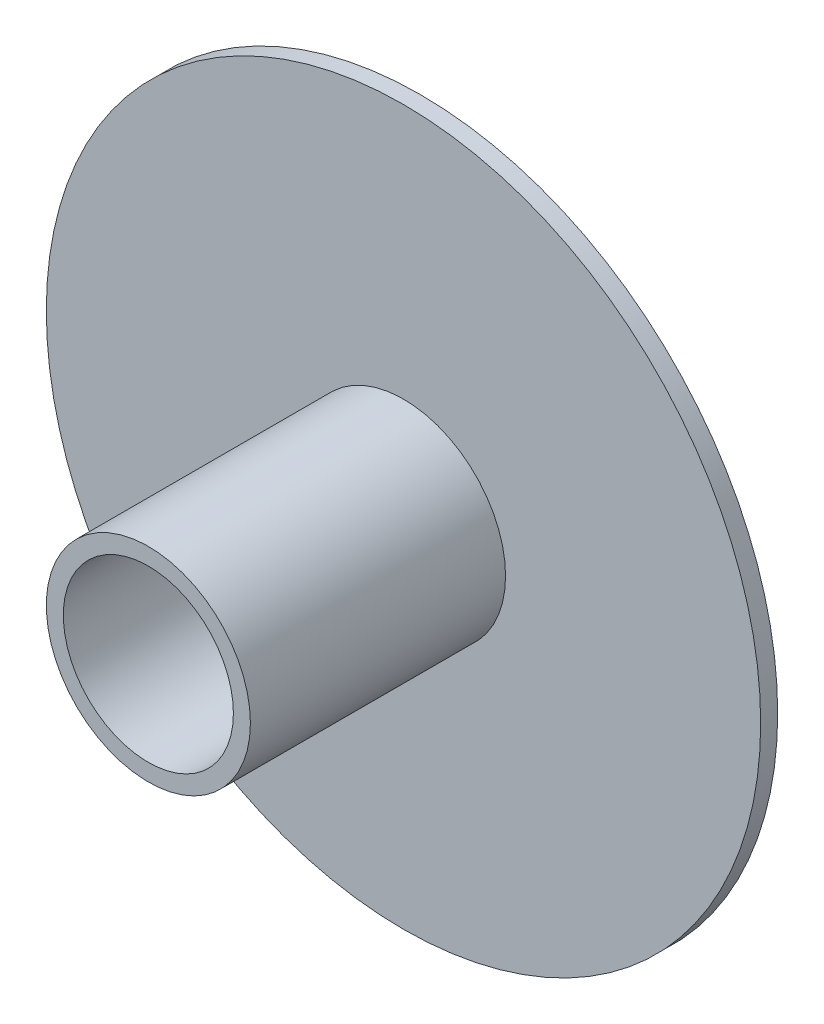
ISO-10303-21;
HEADER;
FILE_DESCRIPTION(('STEP AP214'),'2;1');
FILE_NAME('part.step','',(''),(''),'','','');
FILE_SCHEMA(('AUTOMOTIVE_DESIGN { 1 0 10303 214 1 1 1 1 }'));
ENDSEC;
DATA;
#1=APPLICATION_CONTEXT('core data for automotive mechanical design processes');
#2=APPLICATION_PROTOCOL_DEFINITION('international standard','automotive_design',2000,#1);
#3=PRODUCT_CONTEXT('',#1,'mechanical');
#4=PRODUCT('Part','Part','',(#3));
#5=PRODUCT_RELATED_PRODUCT_CATEGORY('part','',(#4));
#6=PRODUCT_DEFINITION_FORMATION('','',#4);
#7=PRODUCT_DEFINITION_CONTEXT('part definition',#1,'design');
#8=PRODUCT_DEFINITION('design','',#6,#7);
#9=PRODUCT_DEFINITION_SHAPE('','',#8);
#10=(LENGTH_UNIT() NAMED_UNIT(*) SI_UNIT(.MILLI.,.METRE.));
#11=(NAMED_UNIT(*) PLANE_ANGLE_UNIT() SI_UNIT($,.RADIAN.));
#12=(NAMED_UNIT(*) SI_UNIT($,.STERADIAN.) SOLID_ANGLE_UNIT());
#13=UNCERTAINTY_MEASURE_WITH_UNIT(LENGTH_MEASURE(1.E-05),#10,'distance_accuracy_value','');
#14=(GEOMETRIC_REPRESENTATION_CONTEXT(3) GLOBAL_UNCERTAINTY_ASSIGNED_CONTEXT((#13)) GLOBAL_UNIT_ASSIGNED_CONTEXT((#10,
#11,#12)) REPRESENTATION_CONTEXT('',''));
#15=CARTESIAN_POINT('',(0.,0.,0.));
#16=DIRECTION('',(0.,0.,1.));
#17=DIRECTION('',(1.,0.,0.));
#18=AXIS2_PLACEMENT_3D('',#15,#16,#17);
#19=CARTESIAN_POINT('',(0.,0.,1.));
#20=DIRECTION('',(0.,0.,-1.));
#21=DIRECTION('',(-1.,0.,0.));
#22=AXIS2_PLACEMENT_3D('',#19,#20,#21);
#23=CYLINDRICAL_SURFACE('',#22,21.);
#24=CARTESIAN_POINT('',(0.,0.,1.));
#25=DIRECTION('',(0.,0.,1.));
#26=DIRECTION('',(1.,0.,0.));
#27=AXIS2_PLACEMENT_3D('',#24,#25,#26);
#28=CIRCLE('',#27,21.);
#29=CARTESIAN_POINT('',(21.,0.,1.));
#30=VERTEX_POINT('',#29);
#31=EDGE_CURVE('E10',#30,#30,#28,.T.);
#32=ORIENTED_EDGE('',*,*,#31,.F.);
#33=EDGE_LOOP('',(#32));
#34=FACE_BOUND('',#33,.T.);
#35=CARTESIAN_POINT('',(0.,0.,0.));
#36=DIRECTION('',(0.,0.,1.));
#37=DIRECTION('',(1.,0.,0.));
#38=AXIS2_PLACEMENT_3D('',#35,#36,#37);
#39=CIRCLE('',#38,21.);
#40=CARTESIAN_POINT('',(21.,0.,0.));
#41=VERTEX_POINT('',#40);
#42=EDGE_CURVE('E38',#41,#41,#39,.T.);
#43=ORIENTED_EDGE('',*,*,#42,.T.);
#44=EDGE_LOOP('',(#43));
#45=FACE_BOUND('',#44,.T.);
#46=ADVANCED_FACE('F31',(#34,#45),#23,.T.);
#47=CARTESIAN_POINT('',(0.,0.,1.));
#48=DIRECTION('',(0.,0.,1.));
#49=DIRECTION('',(1.,0.,0.));
#50=AXIS2_PLACEMENT_3D('',#47,#48,#49);
#51=PLANE('',#50);
#52=CARTESIAN_POINT('',(0.,0.,1.));
#53=DIRECTION('',(0.,0.,1.));
#54=DIRECTION('',(1.,0.,0.));
#55=AXIS2_PLACEMENT_3D('',#52,#53,#54);
#56=CIRCLE('',#55,6.);
#57=CARTESIAN_POINT('',(6.,0.,1.));
#58=VERTEX_POINT('',#57);
#59=EDGE_CURVE('E45',#58,#58,#56,.T.);
#60=ORIENTED_EDGE('',*,*,#59,.F.);
#61=EDGE_LOOP('',(#60));
#62=FACE_BOUND('',#61,.T.);
#63=ORIENTED_EDGE('',*,*,#31,.T.);
#64=EDGE_LOOP('',(#63));
#65=FACE_BOUND('',#64,.T.);
#66=ADVANCED_FACE('F73',(#62,#65),#51,.T.);
#67=CARTESIAN_POINT('',(0.,0.,0.));
#68=DIRECTION('',(0.,0.,1.));
#69=DIRECTION('',(1.,0.,0.));
#70=AXIS2_PLACEMENT_3D('',#67,#68,#69);
#71=PLANE('',#70);
#72=CARTESIAN_POINT('',(0.,0.,0.));
#73=DIRECTION('',(0.,0.,1.));
#74=DIRECTION('',(1.,0.,0.));
#75=AXIS2_PLACEMENT_3D('',#72,#73,#74);
#76=CIRCLE('',#75,5.);
#77=CARTESIAN_POINT('',(5.,0.,0.));
#78=VERTEX_POINT('',#77);
#79=EDGE_CURVE('E50',#78,#78,#76,.T.);
#80=ORIENTED_EDGE('',*,*,#79,.T.);
#81=EDGE_LOOP('',(#80));
#82=FACE_BOUND('',#81,.T.);
#83=ORIENTED_EDGE('',*,*,#42,.F.);
#84=EDGE_LOOP('',(#83));
#85=FACE_BOUND('',#84,.T.);
#86=ADVANCED_FACE('F69',(#82,#85),#71,.F.);
#87=CARTESIAN_POINT('',(0.,0.,16.));
#88=DIRECTION('',(0.,0.,-1.));
#89=DIRECTION('',(-1.,0.,0.));
#90=AXIS2_PLACEMENT_3D('',#87,#88,#89);
#91=CYLINDRICAL_SURFACE('',#90,6.);
#92=CARTESIAN_POINT('',(0.,0.,16.));
#93=DIRECTION('',(0.,0.,1.));
#94=DIRECTION('',(1.,0.,0.));
#95=AXIS2_PLACEMENT_3D('',#92,#93,#94);
#96=CIRCLE('',#95,6.);
#97=CARTESIAN_POINT('',(6.,0.,16.));
#98=VERTEX_POINT('',#97);
#99=EDGE_CURVE('E43',#98,#98,#96,.T.);
#100=ORIENTED_EDGE('',*,*,#99,.F.);
#101=EDGE_LOOP('',(#100));
#102=FACE_BOUND('',#101,.T.);
#103=ORIENTED_EDGE('',*,*,#59,.T.);
#104=EDGE_LOOP('',(#103));
#105=FACE_BOUND('',#104,.T.);
#106=ADVANCED_FACE('F63',(#102,#105),#91,.T.);
#107=CARTESIAN_POINT('',(0.,0.,16.));
#108=DIRECTION('',(0.,0.,1.));
#109=DIRECTION('',(1.,0.,0.));
#110=AXIS2_PLACEMENT_3D('',#107,#108,#109);
#111=PLANE('',#110);
#112=CARTESIAN_POINT('',(0.,0.,16.));
#113=DIRECTION('',(0.,0.,1.));
#114=DIRECTION('',(1.,0.,0.));
#115=AXIS2_PLACEMENT_3D('',#112,#113,#114);
#116=CIRCLE('',#115,5.);
#117=CARTESIAN_POINT('',(5.,0.,16.));
#118=VERTEX_POINT('',#117);
#119=EDGE_CURVE('E34',#118,#118,#116,.T.);
#120=ORIENTED_EDGE('',*,*,#119,.F.);
#121=EDGE_LOOP('',(#120));
#122=FACE_BOUND('',#121,.T.);
#123=ORIENTED_EDGE('',*,*,#99,.T.);
#124=EDGE_LOOP('',(#123));
#125=FACE_BOUND('',#124,.T.);
#126=ADVANCED_FACE('F60',(#122,#125),#111,.T.);
#127=CARTESIAN_POINT('',(0.,0.,0.));
#128=DIRECTION('',(0.,0.,1.));
#129=DIRECTION('',(1.,0.,0.));
#130=AXIS2_PLACEMENT_3D('',#127,#128,#129);
#131=CYLINDRICAL_SURFACE('',#130,5.);
#132=ORIENTED_EDGE('',*,*,#119,.T.);
#133=EDGE_LOOP('',(#132));
#134=FACE_BOUND('',#133,.T.);
#135=ORIENTED_EDGE('',*,*,#79,.F.);
#136=EDGE_LOOP('',(#135));
#137=FACE_BOUND('',#136,.T.);
#138=ADVANCED_FACE('F57',(#134,#137),#131,.F.);
#139=CLOSED_SHELL('',(#46,#66,#86,#106,#126,#138));
#140=MANIFOLD_SOLID_BREP('B2',#139);
#141=ADVANCED_BREP_SHAPE_REPRESENTATION('',(#18,#140),#14);
#142=SHAPE_DEFINITION_REPRESENTATION(#9,#141);
ENDSEC;
END-ISO-10303-21;
